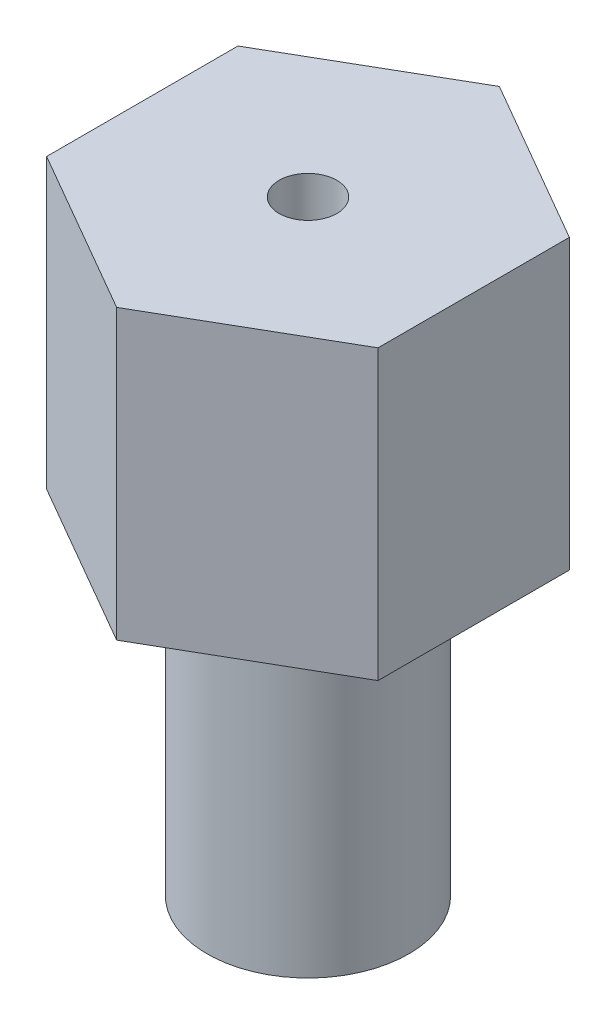
ISO-10303-21;
HEADER;
FILE_DESCRIPTION(('STEP AP214'),'2;1');
FILE_NAME('part.step','',(''),(''),'','','');
FILE_SCHEMA(('AUTOMOTIVE_DESIGN { 1 0 10303 214 1 1 1 1 }'));
ENDSEC;
DATA;
#1=APPLICATION_CONTEXT('core data for automotive mechanical design processes');
#2=APPLICATION_PROTOCOL_DEFINITION('international standard','automotive_design',2000,#1);
#3=PRODUCT_CONTEXT('',#1,'mechanical');
#4=PRODUCT('Part','Part','',(#3));
#5=PRODUCT_RELATED_PRODUCT_CATEGORY('part','',(#4));
#6=PRODUCT_DEFINITION_FORMATION('','',#4);
#7=PRODUCT_DEFINITION_CONTEXT('part definition',#1,'design');
#8=PRODUCT_DEFINITION('design','',#6,#7);
#9=PRODUCT_DEFINITION_SHAPE('','',#8);
#10=(LENGTH_UNIT() NAMED_UNIT(*) SI_UNIT(.MILLI.,.METRE.));
#11=(NAMED_UNIT(*) PLANE_ANGLE_UNIT() SI_UNIT($,.RADIAN.));
#12=(NAMED_UNIT(*) SI_UNIT($,.STERADIAN.) SOLID_ANGLE_UNIT());
#13=UNCERTAINTY_MEASURE_WITH_UNIT(LENGTH_MEASURE(1.E-05),#10,'distance_accuracy_value','');
#14=(GEOMETRIC_REPRESENTATION_CONTEXT(3) GLOBAL_UNCERTAINTY_ASSIGNED_CONTEXT((#13)) GLOBAL_UNIT_ASSIGNED_CONTEXT((#10,
#11,#12)) REPRESENTATION_CONTEXT('',''));
#15=CARTESIAN_POINT('',(0.,0.,0.));
#16=DIRECTION('',(0.,0.,1.));
#17=DIRECTION('',(1.,0.,0.));
#18=AXIS2_PLACEMENT_3D('',#15,#16,#17);
#19=CARTESIAN_POINT('',(5.74999999999997,10.,-3.31976404784042));
#20=DIRECTION('',(-0.499999999999995,0.,0.866025403784442));
#21=DIRECTION('',(0.866025403784442,0.,0.499999999999995));
#22=AXIS2_PLACEMENT_3D('',#19,#20,#21);
#23=PLANE('',#22);
#24=DIRECTION('',(-0.866025403784442,0.,-0.499999999999995));
#25=VECTOR('',#24,1.);
#26=CARTESIAN_POINT('',(5.74999999999997,0.,-3.31976404784042));
#27=LINE('',#26,#25);
#28=CARTESIAN_POINT('',(5.74999999999997,0.,-3.31976404784042));
#29=VERTEX_POINT('',#28);
#30=CARTESIAN_POINT('',(0.,0.,-6.6395280956807));
#31=VERTEX_POINT('',#30);
#32=EDGE_CURVE('E119',#29,#31,#27,.T.);
#33=ORIENTED_EDGE('',*,*,#32,.T.);
#34=DIRECTION('',(0.,-1.,0.));
#35=VECTOR('',#34,1.);
#36=CARTESIAN_POINT('',(0.,10.,-6.6395280956807));
#37=LINE('',#36,#35);
#38=CARTESIAN_POINT('',(0.,10.,-6.6395280956807));
#39=VERTEX_POINT('',#38);
#40=EDGE_CURVE('E36',#39,#31,#37,.T.);
#41=ORIENTED_EDGE('',*,*,#40,.F.);
#42=DIRECTION('',(-0.866025403784442,0.,-0.499999999999995));
#43=VECTOR('',#42,1.);
#44=CARTESIAN_POINT('',(5.74999999999997,10.,-3.31976404784042));
#45=LINE('',#44,#43);
#46=CARTESIAN_POINT('',(5.74999999999997,10.,-3.31976404784042));
#47=VERTEX_POINT('',#46);
#48=EDGE_CURVE('E130',#47,#39,#45,.T.);
#49=ORIENTED_EDGE('',*,*,#48,.F.);
#50=DIRECTION('',(0.,-1.,0.));
#51=VECTOR('',#50,1.);
#52=CARTESIAN_POINT('',(5.74999999999997,10.,-3.31976404784042));
#53=LINE('',#52,#51);
#54=EDGE_CURVE('E115',#47,#29,#53,.T.);
#55=ORIENTED_EDGE('',*,*,#54,.T.);
#56=EDGE_LOOP('',(#33,#41,#49,#55));
#57=FACE_BOUND('',#56,.T.);
#58=ADVANCED_FACE('F33',(#57),#23,.F.);
#59=CARTESIAN_POINT('',(0.,10.,-6.6395280956807));
#60=DIRECTION('',(0.500000000000001,0.,0.866025403784438));
#61=DIRECTION('',(0.866025403784438,0.,-0.500000000000001));
#62=AXIS2_PLACEMENT_3D('',#59,#60,#61);
#63=PLANE('',#62);
#64=DIRECTION('',(-0.866025403784438,0.,0.500000000000001));
#65=VECTOR('',#64,1.);
#66=CARTESIAN_POINT('',(0.,0.,-6.6395280956807));
#67=LINE('',#66,#65);
#68=CARTESIAN_POINT('',(-5.75000000000001,0.,-3.31976404784034));
#69=VERTEX_POINT('',#68);
#70=EDGE_CURVE('E122',#31,#69,#67,.T.);
#71=ORIENTED_EDGE('',*,*,#70,.T.);
#72=DIRECTION('',(0.,-1.,0.));
#73=VECTOR('',#72,1.);
#74=CARTESIAN_POINT('',(-5.75000000000001,10.,-3.31976404784034));
#75=LINE('',#74,#73);
#76=CARTESIAN_POINT('',(-5.75000000000001,10.,-3.31976404784034));
#77=VERTEX_POINT('',#76);
#78=EDGE_CURVE('E133',#77,#69,#75,.T.);
#79=ORIENTED_EDGE('',*,*,#78,.F.);
#80=DIRECTION('',(-0.866025403784438,0.,0.500000000000001));
#81=VECTOR('',#80,1.);
#82=CARTESIAN_POINT('',(0.,10.,-6.6395280956807));
#83=LINE('',#82,#81);
#84=EDGE_CURVE('E88',#39,#77,#83,.T.);
#85=ORIENTED_EDGE('',*,*,#84,.F.);
#86=ORIENTED_EDGE('',*,*,#40,.T.);
#87=EDGE_LOOP('',(#71,#79,#85,#86));
#88=FACE_BOUND('',#87,.T.);
#89=ADVANCED_FACE('F138',(#88),#63,.F.);
#90=CARTESIAN_POINT('',(-5.75000000000001,10.,-3.31976404784034));
#91=DIRECTION('',(1.,0.,0.));
#92=DIRECTION('',(0.,0.,-1.));
#93=AXIS2_PLACEMENT_3D('',#90,#91,#92);
#94=PLANE('',#93);
#95=DIRECTION('',(0.,0.,1.));
#96=VECTOR('',#95,1.);
#97=CARTESIAN_POINT('',(-5.75000000000001,0.,-3.31976404784034));
#98=LINE('',#97,#96);
#99=CARTESIAN_POINT('',(-5.74999999999999,0.,3.31976404784038));
#100=VERTEX_POINT('',#99);
#101=EDGE_CURVE('E125',#69,#100,#98,.T.);
#102=ORIENTED_EDGE('',*,*,#101,.T.);
#103=DIRECTION('',(0.,-1.,0.));
#104=VECTOR('',#103,1.);
#105=CARTESIAN_POINT('',(-5.74999999999999,10.,3.31976404784038));
#106=LINE('',#105,#104);
#107=CARTESIAN_POINT('',(-5.74999999999999,10.,3.31976404784038));
#108=VERTEX_POINT('',#107);
#109=EDGE_CURVE('E110',#108,#100,#106,.T.);
#110=ORIENTED_EDGE('',*,*,#109,.F.);
#111=DIRECTION('',(0.,0.,1.));
#112=VECTOR('',#111,1.);
#113=CARTESIAN_POINT('',(-5.75000000000001,10.,-3.31976404784034));
#114=LINE('',#113,#112);
#115=EDGE_CURVE('E101',#77,#108,#114,.T.);
#116=ORIENTED_EDGE('',*,*,#115,.F.);
#117=ORIENTED_EDGE('',*,*,#78,.T.);
#118=EDGE_LOOP('',(#102,#110,#116,#117));
#119=FACE_BOUND('',#118,.T.);
#120=ADVANCED_FACE('F144',(#119),#94,.F.);
#121=CARTESIAN_POINT('',(-5.74999999999999,10.,3.31976404784038));
#122=DIRECTION('',(0.499999999999995,0.,-0.866025403784442));
#123=DIRECTION('',(-0.866025403784442,0.,-0.499999999999995));
#124=AXIS2_PLACEMENT_3D('',#121,#122,#123);
#125=PLANE('',#124);
#126=DIRECTION('',(0.866025403784441,0.,0.499999999999995));
#127=VECTOR('',#126,1.);
#128=CARTESIAN_POINT('',(-5.74999999999999,0.,3.31976404784038));
#129=LINE('',#128,#127);
#130=CARTESIAN_POINT('',(0.,0.,6.6395280956807));
#131=VERTEX_POINT('',#130);
#132=EDGE_CURVE('E109',#100,#131,#129,.T.);
#133=ORIENTED_EDGE('',*,*,#132,.T.);
#134=DIRECTION('',(0.,-1.,0.));
#135=VECTOR('',#134,1.);
#136=CARTESIAN_POINT('',(0.,10.,6.6395280956807));
#137=LINE('',#136,#135);
#138=CARTESIAN_POINT('',(0.,10.,6.6395280956807));
#139=VERTEX_POINT('',#138);
#140=EDGE_CURVE('E106',#139,#131,#137,.T.);
#141=ORIENTED_EDGE('',*,*,#140,.F.);
#142=DIRECTION('',(0.866025403784441,0.,0.499999999999995));
#143=VECTOR('',#142,1.);
#144=CARTESIAN_POINT('',(-5.74999999999999,10.,3.31976404784038));
#145=LINE('',#144,#143);
#146=EDGE_CURVE('E95',#108,#139,#145,.T.);
#147=ORIENTED_EDGE('',*,*,#146,.F.);
#148=ORIENTED_EDGE('',*,*,#109,.T.);
#149=EDGE_LOOP('',(#133,#141,#147,#148));
#150=FACE_BOUND('',#149,.T.);
#151=ADVANCED_FACE('F107',(#150),#125,.F.);
#152=CARTESIAN_POINT('',(0.,10.,6.6395280956807));
#153=DIRECTION('',(-0.500000000000007,0.,-0.866025403784435));
#154=DIRECTION('',(-0.866025403784435,0.,0.500000000000007));
#155=AXIS2_PLACEMENT_3D('',#152,#153,#154);
#156=PLANE('',#155);
#157=DIRECTION('',(0.866025403784435,0.,-0.500000000000007));
#158=VECTOR('',#157,1.);
#159=CARTESIAN_POINT('',(0.,0.,6.6395280956807));
#160=LINE('',#159,#158);
#161=CARTESIAN_POINT('',(5.75000000000004,0.,3.3197640478403));
#162=VERTEX_POINT('',#161);
#163=EDGE_CURVE('E73',#131,#162,#160,.T.);
#164=ORIENTED_EDGE('',*,*,#163,.T.);
#165=DIRECTION('',(0.,-1.,0.));
#166=VECTOR('',#165,1.);
#167=CARTESIAN_POINT('',(5.75000000000004,10.,3.3197640478403));
#168=LINE('',#167,#166);
#169=CARTESIAN_POINT('',(5.75000000000004,10.,3.3197640478403));
#170=VERTEX_POINT('',#169);
#171=EDGE_CURVE('E111',#170,#162,#168,.T.);
#172=ORIENTED_EDGE('',*,*,#171,.F.);
#173=DIRECTION('',(0.866025403784435,0.,-0.500000000000007));
#174=VECTOR('',#173,1.);
#175=CARTESIAN_POINT('',(0.,10.,6.6395280956807));
#176=LINE('',#175,#174);
#177=EDGE_CURVE('E99',#139,#170,#176,.T.);
#178=ORIENTED_EDGE('',*,*,#177,.F.);
#179=ORIENTED_EDGE('',*,*,#140,.T.);
#180=EDGE_LOOP('',(#164,#172,#178,#179));
#181=FACE_BOUND('',#180,.T.);
#182=ADVANCED_FACE('F113',(#181),#156,.F.);
#183=CARTESIAN_POINT('',(5.75000000000004,10.,3.3197640478403));
#184=DIRECTION('',(-1.,0.,0.));
#185=DIRECTION('',(0.,0.,1.));
#186=AXIS2_PLACEMENT_3D('',#183,#184,#185);
#187=PLANE('',#186);
#188=DIRECTION('',(0.,0.,-1.));
#189=VECTOR('',#188,1.);
#190=CARTESIAN_POINT('',(5.75000000000004,0.,3.3197640478403));
#191=LINE('',#190,#189);
#192=EDGE_CURVE('E79',#162,#29,#191,.T.);
#193=ORIENTED_EDGE('',*,*,#192,.T.);
#194=ORIENTED_EDGE('',*,*,#54,.F.);
#195=DIRECTION('',(0.,0.,-1.));
#196=VECTOR('',#195,1.);
#197=CARTESIAN_POINT('',(5.75000000000004,10.,3.3197640478403));
#198=LINE('',#197,#196);
#199=EDGE_CURVE('E50',#170,#47,#198,.T.);
#200=ORIENTED_EDGE('',*,*,#199,.F.);
#201=ORIENTED_EDGE('',*,*,#171,.T.);
#202=EDGE_LOOP('',(#193,#194,#200,#201));
#203=FACE_BOUND('',#202,.T.);
#204=ADVANCED_FACE('F176',(#203),#187,.F.);
#205=CARTESIAN_POINT('',(0.,10.,0.));
#206=DIRECTION('',(0.,1.,0.));
#207=DIRECTION('',(0.,0.,1.));
#208=AXIS2_PLACEMENT_3D('',#205,#206,#207);
#209=PLANE('',#208);
#210=CARTESIAN_POINT('',(0.,10.,0.));
#211=DIRECTION('',(0.,1.,0.));
#212=DIRECTION('',(0.,0.,1.));
#213=AXIS2_PLACEMENT_3D('',#210,#211,#212);
#214=CIRCLE('',#213,1.);
#215=CARTESIAN_POINT('',(0.,10.,1.));
#216=VERTEX_POINT('',#215);
#217=EDGE_CURVE('E150',#216,#216,#214,.T.);
#218=ORIENTED_EDGE('',*,*,#217,.F.);
#219=EDGE_LOOP('',(#218));
#220=FACE_BOUND('',#219,.T.);
#221=ORIENTED_EDGE('',*,*,#48,.T.);
#222=ORIENTED_EDGE('',*,*,#84,.T.);
#223=ORIENTED_EDGE('',*,*,#115,.T.);
#224=ORIENTED_EDGE('',*,*,#146,.T.);
#225=ORIENTED_EDGE('',*,*,#177,.T.);
#226=ORIENTED_EDGE('',*,*,#199,.T.);
#227=EDGE_LOOP('',(#221,#222,#223,#224,#225,#226));
#228=FACE_BOUND('',#227,.T.);
#229=ADVANCED_FACE('F97',(#220,#228),#209,.T.);
#230=CARTESIAN_POINT('',(0.,0.,0.));
#231=DIRECTION('',(0.,1.,0.));
#232=DIRECTION('',(0.,0.,1.));
#233=AXIS2_PLACEMENT_3D('',#230,#231,#232);
#234=PLANE('',#233);
#235=CARTESIAN_POINT('',(0.,0.,0.));
#236=DIRECTION('',(0.,-1.,0.));
#237=DIRECTION('',(0.,0.,-1.));
#238=AXIS2_PLACEMENT_3D('',#235,#236,#237);
#239=CIRCLE('',#238,3.5);
#240=CARTESIAN_POINT('',(0.,0.,-3.5));
#241=VERTEX_POINT('',#240);
#242=EDGE_CURVE('E11',#241,#241,#239,.T.);
#243=ORIENTED_EDGE('',*,*,#242,.F.);
#244=EDGE_LOOP('',(#243));
#245=FACE_BOUND('',#244,.T.);
#246=ORIENTED_EDGE('',*,*,#32,.F.);
#247=ORIENTED_EDGE('',*,*,#192,.F.);
#248=ORIENTED_EDGE('',*,*,#163,.F.);
#249=ORIENTED_EDGE('',*,*,#132,.F.);
#250=ORIENTED_EDGE('',*,*,#101,.F.);
#251=ORIENTED_EDGE('',*,*,#70,.F.);
#252=EDGE_LOOP('',(#246,#247,#248,#249,#250,#251));
#253=FACE_BOUND('',#252,.T.);
#254=ADVANCED_FACE('F143',(#245,#253),#234,.F.);
#255=CARTESIAN_POINT('',(0.,-11.,0.));
#256=DIRECTION('',(0.,1.,0.));
#257=DIRECTION('',(0.,0.,1.));
#258=AXIS2_PLACEMENT_3D('',#255,#256,#257);
#259=CYLINDRICAL_SURFACE('',#258,3.5);
#260=CARTESIAN_POINT('',(0.,-11.,0.));
#261=DIRECTION('',(0.,-1.,0.));
#262=DIRECTION('',(0.,0.,-1.));
#263=AXIS2_PLACEMENT_3D('',#260,#261,#262);
#264=CIRCLE('',#263,3.5);
#265=CARTESIAN_POINT('',(0.,-11.,-3.5));
#266=VERTEX_POINT('',#265);
#267=EDGE_CURVE('E123',#266,#266,#264,.T.);
#268=ORIENTED_EDGE('',*,*,#267,.F.);
#269=EDGE_LOOP('',(#268));
#270=FACE_BOUND('',#269,.T.);
#271=ORIENTED_EDGE('',*,*,#242,.T.);
#272=EDGE_LOOP('',(#271));
#273=FACE_BOUND('',#272,.T.);
#274=ADVANCED_FACE('F162',(#270,#273),#259,.T.);
#275=CARTESIAN_POINT('',(0.,-11.,0.));
#276=DIRECTION('',(0.,-1.,0.));
#277=DIRECTION('',(0.,0.,-1.));
#278=AXIS2_PLACEMENT_3D('',#275,#276,#277);
#279=PLANE('',#278);
#280=CARTESIAN_POINT('',(0.,-11.,0.));
#281=DIRECTION('',(0.,-1.,0.));
#282=DIRECTION('',(0.,0.,-1.));
#283=AXIS2_PLACEMENT_3D('',#280,#281,#282);
#284=CIRCLE('',#283,1.);
#285=CARTESIAN_POINT('',(0.,-11.,-1.));
#286=VERTEX_POINT('',#285);
#287=EDGE_CURVE('E153',#286,#286,#284,.T.);
#288=ORIENTED_EDGE('',*,*,#287,.F.);
#289=EDGE_LOOP('',(#288));
#290=FACE_BOUND('',#289,.T.);
#291=ORIENTED_EDGE('',*,*,#267,.T.);
#292=EDGE_LOOP('',(#291));
#293=FACE_BOUND('',#292,.T.);
#294=ADVANCED_FACE('F159',(#290,#293),#279,.T.);
#295=CARTESIAN_POINT('',(0.,29.,0.));
#296=DIRECTION('',(0.,-1.,0.));
#297=DIRECTION('',(0.,0.,-1.));
#298=AXIS2_PLACEMENT_3D('',#295,#296,#297);
#299=CYLINDRICAL_SURFACE('',#298,1.);
#300=ORIENTED_EDGE('',*,*,#217,.T.);
#301=EDGE_LOOP('',(#300));
#302=FACE_BOUND('',#301,.T.);
#303=ORIENTED_EDGE('',*,*,#287,.T.);
#304=EDGE_LOOP('',(#303));
#305=FACE_BOUND('',#304,.T.);
#306=ADVANCED_FACE('F157',(#302,#305),#299,.F.);
#307=CLOSED_SHELL('',(#58,#89,#120,#151,#182,#204,#229,#254,#274,#294,#306));
#308=MANIFOLD_SOLID_BREP('B2',#307);
#309=ADVANCED_BREP_SHAPE_REPRESENTATION('',(#18,#308),#14);
#310=SHAPE_DEFINITION_REPRESENTATION(#9,#309);
ENDSEC;
END-ISO-10303-21;
